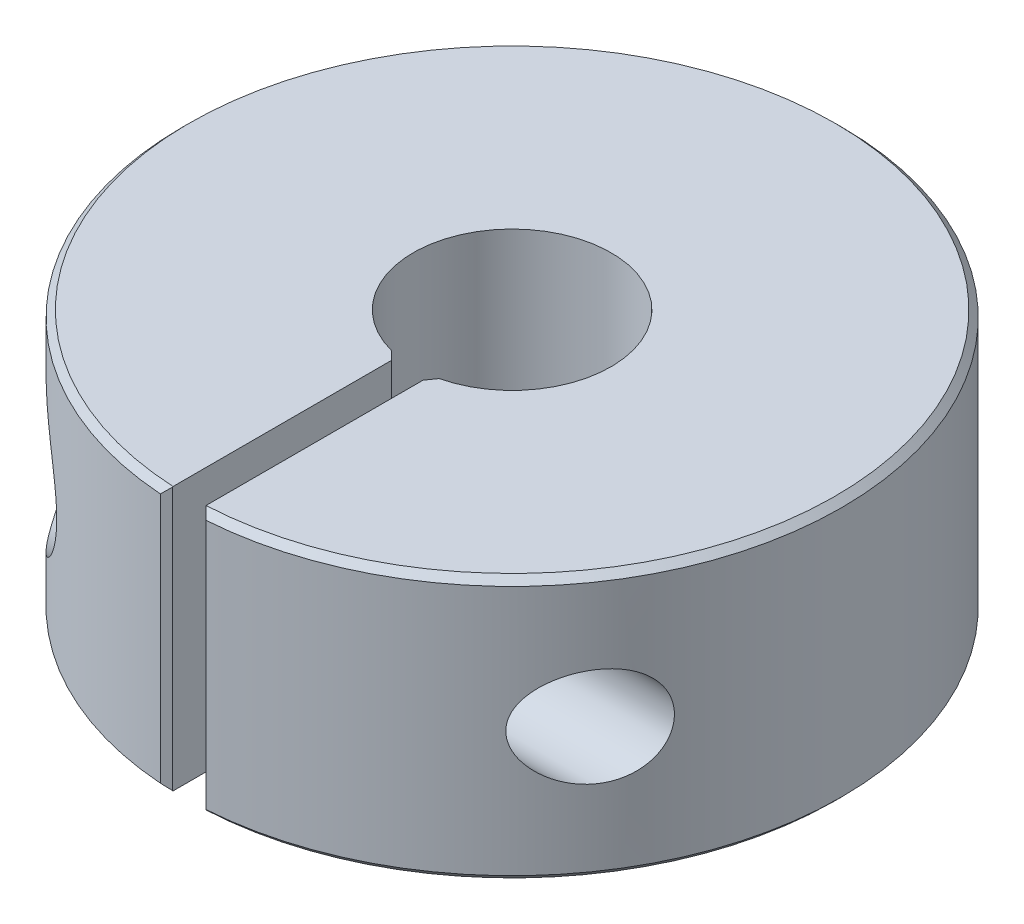
ISO-10303-21;
HEADER;
FILE_DESCRIPTION(('STEP AP214'),'2;1');
FILE_NAME('part.step','',(''),(''),'','','');
FILE_SCHEMA(('AUTOMOTIVE_DESIGN { 1 0 10303 214 1 1 1 1 }'));
ENDSEC;
DATA;
#1=APPLICATION_CONTEXT('core data for automotive mechanical design processes');
#2=APPLICATION_PROTOCOL_DEFINITION('international standard','automotive_design',2000,#1);
#3=PRODUCT_CONTEXT('',#1,'mechanical');
#4=PRODUCT('Part','Part','',(#3));
#5=PRODUCT_RELATED_PRODUCT_CATEGORY('part','',(#4));
#6=PRODUCT_DEFINITION_FORMATION('','',#4);
#7=PRODUCT_DEFINITION_CONTEXT('part definition',#1,'design');
#8=PRODUCT_DEFINITION('design','',#6,#7);
#9=PRODUCT_DEFINITION_SHAPE('','',#8);
#10=(LENGTH_UNIT() NAMED_UNIT(*) SI_UNIT(.MILLI.,.METRE.));
#11=(NAMED_UNIT(*) PLANE_ANGLE_UNIT() SI_UNIT($,.RADIAN.));
#12=(NAMED_UNIT(*) SI_UNIT($,.STERADIAN.) SOLID_ANGLE_UNIT());
#13=UNCERTAINTY_MEASURE_WITH_UNIT(LENGTH_MEASURE(1.E-05),#10,'distance_accuracy_value','');
#14=(GEOMETRIC_REPRESENTATION_CONTEXT(3) GLOBAL_UNCERTAINTY_ASSIGNED_CONTEXT((#13)) GLOBAL_UNIT_ASSIGNED_CONTEXT((#10,
#11,#12)) REPRESENTATION_CONTEXT('',''));
#15=CARTESIAN_POINT('',(0.,0.,0.));
#16=DIRECTION('',(0.,0.,1.));
#17=DIRECTION('',(1.,0.,0.));
#18=AXIS2_PLACEMENT_3D('',#15,#16,#17);
#19=CARTESIAN_POINT('',(0.,4.,0.));
#20=DIRECTION('',(0.,-1.,0.));
#21=DIRECTION('',(0.,0.,-1.));
#22=AXIS2_PLACEMENT_3D('',#19,#20,#21);
#23=CYLINDRICAL_SURFACE('',#22,10.);
#24=CARTESIAN_POINT('',(-9.56526568498302,0.,2.91645201840976));
#25=CARTESIAN_POINT('',(-9.56526527898537,0.148266947419081,2.91644805574262));
#26=CARTESIAN_POINT('',(-9.5616242409526,0.296503336295936,2.92847484811556));
#27=CARTESIAN_POINT('',(-9.54689716743945,0.588716962090297,2.97613433369995));
#28=CARTESIAN_POINT('',(-9.53581356039509,0.732695572285058,3.01175932700255));
#29=CARTESIAN_POINT('',(-9.50575675400809,1.01233217441802,3.10531513407493));
#30=CARTESIAN_POINT('',(-9.48678369481458,1.1479903141129,3.16324555160721));
#31=CARTESIAN_POINT('',(-9.44034621989921,1.40721011207905,3.2992426115922));
#32=CARTESIAN_POINT('',(-9.41288185308885,1.53077184002248,3.37730913805677));
#33=CARTESIAN_POINT('',(-9.34875573322593,1.76304331993647,3.5509630107994));
#34=CARTESIAN_POINT('',(-9.31205529638125,1.87168755776449,3.64662358156792));
#35=CARTESIAN_POINT('',(-9.22918147031763,2.07100284784143,3.8515454751007));
#36=CARTESIAN_POINT('',(-9.18300771206496,2.16167319964604,3.96080732763837));
#37=CARTESIAN_POINT('',(-9.07968729579243,2.32600242668557,4.19235056195457));
#38=CARTESIAN_POINT('',(-9.0222503934866,2.39906217807296,4.31492624617871));
#39=CARTESIAN_POINT('',(-8.89789917658437,2.52405511309625,4.5658529653815));
#40=CARTESIAN_POINT('',(-8.83098214529935,2.57598222424625,4.69420564863646));
#41=CARTESIAN_POINT('',(-8.68259857562874,2.66276043390266,4.96367404339943));
#42=CARTESIAN_POINT('',(-8.60038122918725,2.69580434889333,5.10495400266551));
#43=CARTESIAN_POINT('',(-8.42742318861182,2.73932392625721,5.38570263899248));
#44=CARTESIAN_POINT('',(-8.33667827006593,2.74978834097695,5.52517037895636));
#45=CARTESIAN_POINT('',(-8.13382734279602,2.75023735381917,5.82044926117813));
#46=CARTESIAN_POINT('',(-8.02058184674385,2.73682705984685,5.9754777131459));
#47=CARTESIAN_POINT('',(-7.78749254853974,2.68588136879945,6.27624804532686));
#48=CARTESIAN_POINT('',(-7.66764473815365,2.64833116558173,6.42198416577474));
#49=CARTESIAN_POINT('',(-7.39924932099589,2.54201691682627,6.73058391334973));
#50=CARTESIAN_POINT('',(-7.24976552998386,2.46850384572143,6.8910225225688));
#51=CARTESIAN_POINT('',(-7.0244187750582,2.33720678484105,7.11821805159709));
#52=CARTESIAN_POINT('',(-6.94904537591026,2.28988243009177,7.1917685892005));
#53=CARTESIAN_POINT('',(-6.79851955534688,2.18830760491503,7.33422392286254));
#54=CARTESIAN_POINT('',(-6.72336713725153,2.13405703096424,7.40312864945862));
#55=CARTESIAN_POINT('',(-6.58192217175585,2.02472240864769,7.52903078007034));
#56=CARTESIAN_POINT('',(-6.51553038700257,1.97032838194782,7.58651784986872));
#57=CARTESIAN_POINT('',(-6.38421905418996,1.85588701530281,7.69734502446064));
#58=CARTESIAN_POINT('',(-6.31929891306117,1.79584200482281,7.75068682161849));
#59=CARTESIAN_POINT('',(-6.19185631617,1.66992230304893,7.85287030035755));
#60=CARTESIAN_POINT('',(-6.12933006792844,1.60405743021828,7.90171928774017));
#61=CARTESIAN_POINT('',(-6.00773918906146,1.46606439932564,7.99455542873082));
#62=CARTESIAN_POINT('',(-5.94867241398467,1.39394019160719,8.03854560951532));
#63=CARTESIAN_POINT('',(-5.8274522797352,1.23213881084496,8.1269417735652));
#64=CARTESIAN_POINT('',(-5.76605575841747,1.14142431451149,8.17051615690642));
#65=CARTESIAN_POINT('',(-5.65318218029461,0.950518359548369,8.24901504646066));
#66=CARTESIAN_POINT('',(-5.60169168398769,0.8503400197837,8.28395129066408));
#67=CARTESIAN_POINT('',(-5.52223011850981,0.661699247626612,8.33707358894066));
#68=CARTESIAN_POINT('',(-5.49161207143822,0.57492761084441,8.35721481912961));
#69=CARTESIAN_POINT('',(-5.44260413812306,0.396533832686467,8.38921512466519));
#70=CARTESIAN_POINT('',(-5.42419687024068,0.304918787325577,8.4010859738401));
#71=CARTESIAN_POINT('',(-5.40181159612552,0.118448749400579,8.41549932082236));
#72=CARTESIAN_POINT('',(-5.39794152845488,0.0235747783363938,8.41797203919879));
#73=CARTESIAN_POINT('',(-5.40552244946268,-0.165313247258699,8.41310534978422));
#74=CARTESIAN_POINT('',(-5.41697867271236,-0.259326996944259,8.40576258959624));
#75=CARTESIAN_POINT('',(-5.45165458801781,-0.433750029578807,8.38330593675886));
#76=CARTESIAN_POINT('',(-5.47352580386855,-0.514556833738229,8.36908042689428));
#77=CARTESIAN_POINT('',(-5.52623897087327,-0.671722054745976,8.33436756791654));
#78=CARTESIAN_POINT('',(-5.55708460437112,-0.748078630128073,8.31387764824236));
#79=CARTESIAN_POINT('',(-5.65030162807037,-0.948831124338016,8.25100446505069));
#80=CARTESIAN_POINT('',(-5.71942670539512,-1.06845163742797,8.20345312038104));
#81=CARTESIAN_POINT('',(-5.87011185973074,-1.29379609568387,8.09631976698425));
#82=CARTESIAN_POINT('',(-5.95171658254255,-1.39946750312075,8.03669430456368));
#83=CARTESIAN_POINT('',(-6.10545782086362,-1.57854288700257,7.92027809204851));
#84=CARTESIAN_POINT('',(-6.17631437703535,-1.65421148142424,7.86522304051925));
#85=CARTESIAN_POINT('',(-6.32107473475828,-1.79791944886128,7.749361981115));
#86=CARTESIAN_POINT('',(-6.39498029558843,-1.86595433057114,7.68855262606585));
#87=CARTESIAN_POINT('',(-6.54461191288574,-1.99477296867885,7.56159338936059));
#88=CARTESIAN_POINT('',(-6.62033928398539,-2.05555128788096,7.4954395646577));
#89=CARTESIAN_POINT('',(-6.77261683148125,-2.16995074000298,7.35813665415467));
#90=CARTESIAN_POINT('',(-6.84916684621223,-2.22357325235615,7.28698853515763));
#91=CARTESIAN_POINT('',(-7.00546515295253,-2.32567862668531,7.13692181048283));
#92=CARTESIAN_POINT('',(-7.08521749851788,-2.3738656455105,7.05780525738708));
#93=CARTESIAN_POINT('',(-7.24410445173681,-2.4622526979034,6.89463296961769));
#94=CARTESIAN_POINT('',(-7.32323881923649,-2.50244976171518,6.81057541342663));
#95=CARTESIAN_POINT('',(-7.55851000594961,-2.61036660675842,6.55156652908046));
#96=CARTESIAN_POINT('',(-7.71285767306728,-2.6656352442903,6.36945344112164));
#97=CARTESIAN_POINT('',(-7.98768790504225,-2.73204938756373,6.01982690839229));
#98=CARTESIAN_POINT('',(-8.10967190349656,-2.74877965682176,5.85454178850282));
#99=CARTESIAN_POINT('',(-8.34327058290231,-2.75108810378651,5.51650407334515));
#100=CARTESIAN_POINT('',(-8.45489656286387,-2.73670065288688,5.34375992359064));
#101=CARTESIAN_POINT('',(-8.64811631093501,-2.67800506784768,5.02387924464175));
#102=CARTESIAN_POINT('',(-8.73166983562445,-2.63877498966649,4.8770018920849));
#103=CARTESIAN_POINT('',(-8.88759111706612,-2.5338531057295,4.58669947269393));
#104=CARTESIAN_POINT('',(-8.95996292079055,-2.46817090491213,4.44327317277132));
#105=CARTESIAN_POINT('',(-9.09269156456916,-2.3095027650383,4.16495934244637));
#106=CARTESIAN_POINT('',(-9.15298114951672,-2.21637075264733,4.03012231181652));
#107=CARTESIAN_POINT('',(-9.26055392112583,-2.0043641185328,3.7763958729351));
#108=CARTESIAN_POINT('',(-9.3078423490504,-1.88549990508693,3.65750004810742));
#109=CARTESIAN_POINT('',(-9.38566650405083,-1.63838981592324,3.45255231023448));
#110=CARTESIAN_POINT('',(-9.41739940276019,-1.5122472200721,3.36441147380208));
#111=CARTESIAN_POINT('',(-9.47121760239906,-1.24542685356331,3.2097917210802));
#112=CARTESIAN_POINT('',(-9.49330251809162,-1.1047485027808,3.1433136697969));
#113=CARTESIAN_POINT('',(-9.52933453999021,-0.806615232213448,3.0323878667646));
#114=CARTESIAN_POINT('',(-9.54287064565883,-0.648690209132174,2.9890663100111));
#115=CARTESIAN_POINT('',(-9.5608360020514,-0.32716402758318,2.93110195734074));
#116=CARTESIAN_POINT('',(-9.56526613286682,-0.163563419214473,2.91645638989915));
#117=CARTESIAN_POINT('',(-9.56526568498302,0.,2.91645201840976));
#118=B_SPLINE_CURVE_WITH_KNOTS('',3,(#24,#25,#26,#27,#28,#29,#30,#31,#32,#33,#34,#35,#36,#37,
#38,#39,#40,#41,#42,#43,#44,#45,#46,#47,#48,#49,#50,#51,#52,#53,#54,#55,#56,#57,#58,#59,#60,#61,
#62,#63,#64,#65,#66,#67,#68,#69,#70,#71,#72,#73,#74,#75,#76,#77,#78,#79,#80,#81,#82,#83,#84,#85,
#86,#87,#88,#89,#90,#91,#92,#93,#94,#95,#96,#97,#98,#99,#100,#101,#102,#103,#104,#105,#106,#107,
#108,#109,#110,#111,#112,#113,#114,#115,#116,#117),.UNSPECIFIED.,.T.,.F.,(4,2,2,2,2,2,2,2,2,2,2,
2,2,2,2,2,2,2,2,2,2,2,2,2,2,2,2,2,2,2,2,2,2,2,2,2,2,2,2,2,2,2,2,2,2,2,4),(0.,0.444220283479155,
0.88829569269675,1.33236321364445,1.77642817672923,2.22238492289784,2.66835904463477,
3.1278547531585,3.58748240517654,4.08583275376449,4.58443129115964,5.15966308122086,
5.73524802506679,6.42624408248123,6.77238973067179,7.11854055316457,7.4282213243628,
7.737774992578,8.04681604771278,8.35566346217085,8.70845983026258,9.0607741310375,
9.34229315115121,9.62341057343527,9.90661121014732,10.1899085964542,10.4437197268911,
10.6976351472285,11.1334654454718,11.5708930628784,11.9225693124851,12.2744513981984,
12.6265955090624,12.9786716383309,13.3449969358317,13.7114581378209,14.442828486429,
15.0588333027928,15.6741580523,16.1924146875614,16.7104833098792,17.2313601871446,
17.7520267701084,18.2209971370152,18.6899862278566,19.180083401436,19.6701332049496),.UNSPECIFIED.);
#119=CARTESIAN_POINT('',(-9.56526568498302,0.,2.91645201840976));
#120=VERTEX_POINT('',#119);
#121=EDGE_CURVE('E165',#120,#120,#118,.T.);
#122=ORIENTED_EDGE('',*,*,#121,.T.);
#123=EDGE_LOOP('',(#122));
#124=FACE_BOUND('',#123,.T.);
#125=DIRECTION('',(0.,-1.,0.));
#126=VECTOR('',#125,1.);
#127=CARTESIAN_POINT('',(0.688760100747901,4.,9.97625227846699));
#128=LINE('',#127,#126);
#129=CARTESIAN_POINT('',(0.688760100747901,3.80000000000001,9.97625227846699));
#130=VERTEX_POINT('',#129);
#131=CARTESIAN_POINT('',(0.688760100747901,-3.8,9.97625227846699));
#132=VERTEX_POINT('',#131);
#133=EDGE_CURVE('E226',#130,#132,#128,.T.);
#134=ORIENTED_EDGE('',*,*,#133,.T.);
#135=CARTESIAN_POINT('',(0.,-3.8,0.));
#136=DIRECTION('',(0.,1.,0.));
#137=DIRECTION('',(0.,0.,1.));
#138=AXIS2_PLACEMENT_3D('',#135,#136,#137);
#139=CIRCLE('',#138,10.);
#140=CARTESIAN_POINT('',(-0.697693077083156,-3.8,9.97563152738664));
#141=VERTEX_POINT('',#140);
#142=EDGE_CURVE('E231',#132,#141,#139,.T.);
#143=ORIENTED_EDGE('',*,*,#142,.T.);
#144=DIRECTION('',(0.,-1.,0.));
#145=VECTOR('',#144,1.);
#146=CARTESIAN_POINT('',(-0.697693077083156,4.,9.97563152738664));
#147=LINE('',#146,#145);
#148=CARTESIAN_POINT('',(-0.697693077083156,3.80000000000001,9.97563152738664));
#149=VERTEX_POINT('',#148);
#150=EDGE_CURVE('E228',#141,#149,#147,.F.);
#151=ORIENTED_EDGE('',*,*,#150,.T.);
#152=CARTESIAN_POINT('',(0.,3.80000000000001,0.));
#153=DIRECTION('',(0.,1.,0.));
#154=DIRECTION('',(0.,0.,1.));
#155=AXIS2_PLACEMENT_3D('',#152,#153,#154);
#156=CIRCLE('',#155,10.);
#157=EDGE_CURVE('E224',#149,#130,#156,.F.);
#158=ORIENTED_EDGE('',*,*,#157,.T.);
#159=EDGE_LOOP('',(#134,#143,#151,#158));
#160=FACE_BOUND('',#159,.T.);
#161=CARTESIAN_POINT('',(6.97437921738062,0.,7.16645201840976));
#162=CARTESIAN_POINT('',(6.97438043242214,-0.0675590567595136,7.16645103947924));
#163=CARTESIAN_POINT('',(6.97911825624856,-0.135124128170724,7.16184910864587));
#164=CARTESIAN_POINT('',(6.99751951185413,-0.267828838477065,7.14386991150756));
#165=CARTESIAN_POINT('',(7.01119079711041,-0.332966289924161,7.13048492390395));
#166=CARTESIAN_POINT('',(7.04594248167849,-0.458456224922473,7.09614518244943));
#167=CARTESIAN_POINT('',(7.06696263051235,-0.518842869751416,7.07525194807016));
#168=CARTESIAN_POINT('',(7.11484945313477,-0.634492602813443,7.02709558810926));
#169=CARTESIAN_POINT('',(7.14171933514506,-0.68975285572215,6.99982896650672));
#170=CARTESIAN_POINT('',(7.21328606687825,-0.819055665408793,6.92619601008752));
#171=CARTESIAN_POINT('',(7.26048765689773,-0.889998662972199,6.87682211376733));
#172=CARTESIAN_POINT('',(7.36079073765643,-1.02017310248308,6.76935750805091));
#173=CARTESIAN_POINT('',(7.41390552555923,-1.0793772810955,6.71124704540073));
#174=CARTESIAN_POINT('',(7.53865224219387,-1.20098700684466,6.57112898007752));
#175=CARTESIAN_POINT('',(7.61135748921858,-1.25978988158075,6.48694584365539));
#176=CARTESIAN_POINT('',(7.75875565677337,-1.35876571107772,6.30991400168907));
#177=CARTESIAN_POINT('',(7.83344918827038,-1.39893286785491,6.21706261003755));
#178=CARTESIAN_POINT('',(7.98279731223476,-1.46027079566996,6.02411164613885));
#179=CARTESIAN_POINT('',(8.05744800662097,-1.48130724680842,5.92396607591841));
#180=CARTESIAN_POINT('',(8.20392576178793,-1.50258618282718,5.71938924643504));
#181=CARTESIAN_POINT('',(8.27575262613515,-1.50282722366964,5.61495769005605));
#182=CARTESIAN_POINT('',(8.41398959653681,-1.48086760272039,5.4055915301287));
#183=CARTESIAN_POINT('',(8.48042755421717,-1.4587914901239,5.30066293562816));
#184=CARTESIAN_POINT('',(8.60599812081999,-1.39079773534173,5.09424244844872));
#185=CARTESIAN_POINT('',(8.66514585042626,-1.34493050451768,4.99274377054981));
#186=CARTESIAN_POINT('',(8.75823677991854,-1.245685551493,4.82696643963397));
#187=CARTESIAN_POINT('',(8.79452938380881,-1.19828882643361,4.76039562970175));
#188=CARTESIAN_POINT('',(8.86159391516161,-1.09159224843253,4.63435343929815));
#189=CARTESIAN_POINT('',(8.89236889468987,-1.03229901473222,4.57487814008558));
#190=CARTESIAN_POINT('',(8.94787670166238,-0.902543406684585,4.46534515962732));
#191=CARTESIAN_POINT('',(8.9725804417759,-0.832029831414785,4.41533306980214));
#192=CARTESIAN_POINT('',(9.01523579139888,-0.681881828478191,4.32757647037126));
#193=CARTESIAN_POINT('',(9.03318937930682,-0.602250082191563,4.28982836676187));
#194=CARTESIAN_POINT('',(9.0607311370315,-0.443749268845394,4.23132461625462));
#195=CARTESIAN_POINT('',(9.07091444594154,-0.365424718685295,4.20936990121741));
#196=CARTESIAN_POINT('',(9.08522019831489,-0.205729233977635,4.17840541726927));
#197=CARTESIAN_POINT('',(9.08934491426233,-0.124359453398568,4.16939079475949));
#198=CARTESIAN_POINT('',(9.09142467467425,0.0346199154330212,4.16485287722947));
#199=CARTESIAN_POINT('',(9.08968651326818,0.112207343947216,4.16865869700394));
#200=CARTESIAN_POINT('',(9.08073425634532,0.265547778463827,4.18812352309654));
#201=CARTESIAN_POINT('',(9.0735208115104,0.341301001339201,4.2037811209505));
#202=CARTESIAN_POINT('',(9.05377227456714,0.48841972146095,4.24614464579492));
#203=CARTESIAN_POINT('',(9.04126860806533,0.559808324942536,4.27278530634708));
#204=CARTESIAN_POINT('',(9.01112011478995,0.696854515777471,4.33600446980857));
#205=CARTESIAN_POINT('',(8.99347484376496,0.762511607272145,4.37258383143566));
#206=CARTESIAN_POINT('',(8.95261270319017,0.888760400939297,4.45566308717792));
#207=CARTESIAN_POINT('',(8.92922498494869,0.949100011679213,4.50246107389158));
#208=CARTESIAN_POINT('',(8.87762006792735,1.06091811161802,4.60337602477775));
#209=CARTESIAN_POINT('',(8.84940165658632,1.11239436948731,4.65749482584403));
#210=CARTESIAN_POINT('',(8.7862775944587,1.20938693511083,4.77557679324333));
#211=CARTESIAN_POINT('',(8.75102517886305,1.25414411105615,4.83997655532572));
#212=CARTESIAN_POINT('',(8.67614479186936,1.33230179445196,4.97296117087813));
#213=CARTESIAN_POINT('',(8.63651496392137,1.36569745856471,5.04154779452222));
#214=CARTESIAN_POINT('',(8.54861812105136,1.42458301307972,5.18935108845702));
#215=CARTESIAN_POINT('',(8.49988511373887,1.448646983465,5.26885705819558));
#216=CARTESIAN_POINT('',(8.39883127371579,1.4832596098871,5.42849702939673));
#217=CARTESIAN_POINT('',(8.34650879467131,1.49380201992087,5.50863130390845));
#218=CARTESIAN_POINT('',(8.2312244086926,1.50273653658807,5.6797091742514));
#219=CARTESIAN_POINT('',(8.16784176057527,1.49907522521972,5.77047660578135));
#220=CARTESIAN_POINT('',(8.0390711831874,1.47597041971167,5.94856656717726));
#221=CARTESIAN_POINT('',(7.97368139164061,1.45651181473254,6.0358857147015));
#222=CARTESIAN_POINT('',(7.83356964566315,1.39899937144099,6.21691070173135));
#223=CARTESIAN_POINT('',(7.75878092785283,1.35878764954013,6.30988456702186));
#224=CARTESIAN_POINT('',(7.61120142521443,1.25968011147248,6.48713236969326));
#225=CARTESIAN_POINT('',(7.53841013687695,1.20078905186249,6.571408514652));
#226=CARTESIAN_POINT('',(7.41480396817887,1.08022384001148,6.71023202153583));
#227=CARTESIAN_POINT('',(7.3628323850302,1.0224256127084,6.76712128052531));
#228=CARTESIAN_POINT('',(7.26448737602492,0.895561725636916,6.87258240875571));
#229=CARTESIAN_POINT('',(7.21810420360122,0.82651619167828,6.92116882252316));
#230=CARTESIAN_POINT('',(7.14470405431667,0.695945817774737,6.99680355513781));
#231=CARTESIAN_POINT('',(7.11574770237125,0.636878738045196,7.02619741319518));
#232=CARTESIAN_POINT('',(7.06458442849177,0.512876847296229,7.07763825855212));
#233=CARTESIAN_POINT('',(7.04236987493812,0.447948779713759,7.0996935557453));
#234=CARTESIAN_POINT('',(7.00833317962193,0.319904917891187,7.13328743150818));
#235=CARTESIAN_POINT('',(6.99571546510157,0.257218115591715,7.14563505062668));
#236=CARTESIAN_POINT('',(6.97874083112381,0.129688347372152,7.16221493519732));
#237=CARTESIAN_POINT('',(6.97437805111611,0.0648469444043308,7.16645295804178));
#238=CARTESIAN_POINT('',(6.97437921738062,0.,7.16645201840976));
#239=B_SPLINE_CURVE_WITH_KNOTS('',3,(#161,#162,#163,#164,#165,#166,#167,#168,#169,#170,#171,
#172,#173,#174,#175,#176,#177,#178,#179,#180,#181,#182,#183,#184,#185,#186,#187,#188,#189,#190,
#191,#192,#193,#194,#195,#196,#197,#198,#199,#200,#201,#202,#203,#204,#205,#206,#207,#208,#209,
#210,#211,#212,#213,#214,#215,#216,#217,#218,#219,#220,#221,#222,#223,#224,#225,#226,#227,#228,
#229,#230,#231,#232,#233,#234,#235,#236,#237,#238),.UNSPECIFIED.,.T.,.F.,(4,2,2,2,2,2,2,2,2,2,2,
2,2,2,2,2,2,2,2,2,2,2,2,2,2,2,2,2,2,2,2,2,2,2,2,2,2,2,4),(0.,0.202385428020556,0.40494901447937,
0.60588936760391,0.80694020312721,1.10076438942525,1.39526318675775,1.77080663178384,
2.14646683845267,2.52474470012368,2.90304882947088,3.27925328373396,3.65466382951348,
3.92180614314512,4.18880022840906,4.4570495821237,4.72522025337733,4.96989403641787,
5.21447602266704,5.44646221433214,5.67842084110815,5.90902048867049,6.13964006670611,
6.37819647311048,6.61681284803602,6.87371687964772,7.13073029093104,7.41852603060044,
7.70645466369221,8.03745350315283,8.3687693318321,8.74486645480578,9.12086788417919,
9.40888445366355,9.69639119921799,9.91178126473055,10.1269265944333,10.321325461565,
10.5155862643144),.UNSPECIFIED.);
#240=CARTESIAN_POINT('',(6.97437921738062,0.,7.16645201840976));
#241=VERTEX_POINT('',#240);
#242=EDGE_CURVE('E281',#241,#241,#239,.T.);
#243=ORIENTED_EDGE('',*,*,#242,.F.);
#244=EDGE_LOOP('',(#243));
#245=FACE_BOUND('',#244,.T.);
#246=ADVANCED_FACE('F34',(#124,#160,#245),#23,.T.);
#247=CARTESIAN_POINT('',(0.,4.,0.));
#248=DIRECTION('',(0.,-1.,0.));
#249=DIRECTION('',(0.,0.,-1.));
#250=AXIS2_PLACEMENT_3D('',#247,#248,#249);
#251=CYLINDRICAL_SURFACE('',#250,3.);
#252=CARTESIAN_POINT('',(0.,-4.,0.));
#253=DIRECTION('',(0.,-1.,0.));
#254=DIRECTION('',(0.,0.,1.));
#255=AXIS2_PLACEMENT_3D('',#252,#253,#254);
#256=CIRCLE('',#255,3.);
#257=CARTESIAN_POINT('',(-0.754456761053977,-4.,2.90358313049583));
#258=VERTEX_POINT('',#257);
#259=CARTESIAN_POINT('',(0.703070141816121,-4.,2.91645201840981));
#260=VERTEX_POINT('',#259);
#261=EDGE_CURVE('E259',#258,#260,#256,.T.);
#262=ORIENTED_EDGE('',*,*,#261,.T.);
#263=DIRECTION('',(0.,-1.,0.));
#264=VECTOR('',#263,1.);
#265=CARTESIAN_POINT('',(0.703070141816121,4.,2.91645201840981));
#266=LINE('',#265,#264);
#267=CARTESIAN_POINT('',(0.703070141816121,4.,2.91645201840981));
#268=VERTEX_POINT('',#267);
#269=EDGE_CURVE('E51',#260,#268,#266,.F.);
#270=ORIENTED_EDGE('',*,*,#269,.T.);
#271=CARTESIAN_POINT('',(0.,4.,0.));
#272=DIRECTION('',(0.,-1.,0.));
#273=DIRECTION('',(0.,0.,1.));
#274=AXIS2_PLACEMENT_3D('',#271,#272,#273);
#275=CIRCLE('',#274,3.);
#276=CARTESIAN_POINT('',(-0.754456761053977,4.,2.90358313049583));
#277=VERTEX_POINT('',#276);
#278=EDGE_CURVE('E133',#277,#268,#275,.T.);
#279=ORIENTED_EDGE('',*,*,#278,.F.);
#280=DIRECTION('',(0.,-1.,0.));
#281=VECTOR('',#280,1.);
#282=CARTESIAN_POINT('',(-0.754456761053978,4.,2.90358313049583));
#283=LINE('',#282,#281);
#284=EDGE_CURVE('E149',#277,#258,#283,.T.);
#285=ORIENTED_EDGE('',*,*,#284,.T.);
#286=EDGE_LOOP('',(#262,#270,#279,#285));
#287=FACE_BOUND('',#286,.T.);
#288=ADVANCED_FACE('F241',(#287),#251,.F.);
#289=CARTESIAN_POINT('',(0.5,4.,2.95803989154981));
#290=DIRECTION('',(1.,0.,0.));
#291=DIRECTION('',(0.,0.,-1.));
#292=AXIS2_PLACEMENT_3D('',#289,#290,#291);
#293=PLANE('',#292);
#294=CARTESIAN_POINT('',(0.5,0.,5.66645201840976));
#295=DIRECTION('',(1.,0.,0.));
#296=DIRECTION('',(0.,0.,-1.));
#297=AXIS2_PLACEMENT_3D('',#294,#295,#296);
#298=CIRCLE('',#297,1.5);
#299=CARTESIAN_POINT('',(0.500000000000001,0.,4.16645201840976));
#300=VERTEX_POINT('',#299);
#301=EDGE_CURVE('E278',#300,#300,#298,.F.);
#302=ORIENTED_EDGE('',*,*,#301,.F.);
#303=EDGE_LOOP('',(#302));
#304=FACE_BOUND('',#303,.T.);
#305=DIRECTION('',(0.,0.,1.));
#306=VECTOR('',#305,1.);
#307=CARTESIAN_POINT('',(0.5,4.,2.95803989154981));
#308=LINE('',#307,#306);
#309=CARTESIAN_POINT('',(0.5,4.,3.20213682507097));
#310=VERTEX_POINT('',#309);
#311=CARTESIAN_POINT('',(0.499999999999999,4.,9.78723658649366));
#312=VERTEX_POINT('',#311);
#313=EDGE_CURVE('E265',#310,#312,#308,.T.);
#314=ORIENTED_EDGE('',*,*,#313,.F.);
#315=DIRECTION('',(0.,-1.,0.));
#316=VECTOR('',#315,1.);
#317=CARTESIAN_POINT('',(0.5,4.,3.20213682507097));
#318=LINE('',#317,#316);
#319=CARTESIAN_POINT('',(0.5,-4.,3.20213682507097));
#320=VERTEX_POINT('',#319);
#321=EDGE_CURVE('E140',#310,#320,#318,.T.);
#322=ORIENTED_EDGE('',*,*,#321,.T.);
#323=DIRECTION('',(0.,0.,1.));
#324=VECTOR('',#323,1.);
#325=CARTESIAN_POINT('',(0.5,-4.,2.95803989154981));
#326=LINE('',#325,#324);
#327=CARTESIAN_POINT('',(0.499999999999999,-4.,9.78723658649366));
#328=VERTEX_POINT('',#327);
#329=EDGE_CURVE('E134',#320,#328,#326,.T.);
#330=ORIENTED_EDGE('',*,*,#329,.T.);
#331=CARTESIAN_POINT('',(0.499999999999999,-4.,9.78723658649366));
#332=CARTESIAN_POINT('',(0.499999999999999,-3.99995745694086,9.78727918503123));
#333=CARTESIAN_POINT('',(0.499999999999999,-3.99991491388171,9.7873217835688));
#334=CARTESIAN_POINT('',(0.499999999999999,-3.99982982776342,9.78740698064394));
#335=CARTESIAN_POINT('',(0.499999999999999,-3.99978728470428,9.78744957918151));
#336=CARTESIAN_POINT('',(0.499999999999999,-3.99974474164513,9.78749217771908));
#337=B_SPLINE_CURVE_WITH_KNOTS('',3,(#331,#332,#333,#334,#335,#336),.UNSPECIFIED.,.F.,.F.,(4,2,
4),(0.,0.000180612639538693,0.000361225279076158),.UNSPECIFIED.);
#338=CARTESIAN_POINT('',(0.499999999999999,-3.99974474164513,9.78749217771908));
#339=VERTEX_POINT('',#338);
#340=EDGE_CURVE('E139',#328,#339,#337,.T.);
#341=ORIENTED_EDGE('',*,*,#340,.T.);
#342=DIRECTION('',(0.,1.,0.));
#343=VECTOR('',#342,1.);
#344=CARTESIAN_POINT('',(0.499999999999999,4.,9.78749217771908));
#345=LINE('',#344,#343);
#346=CARTESIAN_POINT('',(0.499999999999999,3.99974474164514,9.78749217771908));
#347=VERTEX_POINT('',#346);
#348=EDGE_CURVE('E238',#339,#347,#345,.T.);
#349=ORIENTED_EDGE('',*,*,#348,.T.);
#350=CARTESIAN_POINT('',(0.499999999999999,3.99974474164514,9.78749217771908));
#351=CARTESIAN_POINT('',(0.499999999999999,3.99978728470428,9.78744957918151));
#352=CARTESIAN_POINT('',(0.499999999999999,3.99982982776342,9.78740698064394));
#353=CARTESIAN_POINT('',(0.499999999999999,3.99991491388171,9.7873217835688));
#354=CARTESIAN_POINT('',(0.499999999999999,3.99995745694086,9.78727918503123));
#355=CARTESIAN_POINT('',(0.499999999999999,4.,9.78723658649366));
#356=B_SPLINE_CURVE_WITH_KNOTS('',3,(#350,#351,#352,#353,#354,#355),.UNSPECIFIED.,.F.,.F.,(4,2,
4),(0.,0.000180612639535012,0.000361225279070024),.UNSPECIFIED.);
#357=EDGE_CURVE('E232',#347,#312,#356,.T.);
#358=ORIENTED_EDGE('',*,*,#357,.T.);
#359=EDGE_LOOP('',(#314,#322,#330,#341,#349,#358));
#360=FACE_BOUND('',#359,.T.);
#361=ADVANCED_FACE('F212',(#304,#360),#293,.F.);
#362=CARTESIAN_POINT('',(-0.5,4.,2.95803989154981));
#363=DIRECTION('',(-1.,0.,0.));
#364=DIRECTION('',(0.,0.,1.));
#365=AXIS2_PLACEMENT_3D('',#362,#363,#364);
#366=PLANE('',#365);
#367=CARTESIAN_POINT('',(-0.5,0.,5.66645201840976));
#368=DIRECTION('',(-1.,0.,0.));
#369=DIRECTION('',(0.,0.,1.));
#370=AXIS2_PLACEMENT_3D('',#367,#368,#369);
#371=CIRCLE('',#370,1.5);
#372=CARTESIAN_POINT('',(-0.5,0.,7.16645201840976));
#373=VERTEX_POINT('',#372);
#374=EDGE_CURVE('E38',#373,#373,#371,.F.);
#375=ORIENTED_EDGE('',*,*,#374,.F.);
#376=EDGE_LOOP('',(#375));
#377=FACE_BOUND('',#376,.T.);
#378=DIRECTION('',(0.,0.,-1.));
#379=VECTOR('',#378,1.);
#380=CARTESIAN_POINT('',(-0.5,-4.,2.95803989154981));
#381=LINE('',#380,#379);
#382=CARTESIAN_POINT('',(-0.499999999999999,-4.,9.78723658649366));
#383=VERTEX_POINT('',#382);
#384=CARTESIAN_POINT('',(-0.5,-4.,3.1580398915498));
#385=VERTEX_POINT('',#384);
#386=EDGE_CURVE('E117',#383,#385,#381,.T.);
#387=ORIENTED_EDGE('',*,*,#386,.T.);
#388=DIRECTION('',(0.,1.,0.));
#389=VECTOR('',#388,1.);
#390=CARTESIAN_POINT('',(-0.5,4.,3.1580398915498));
#391=LINE('',#390,#389);
#392=CARTESIAN_POINT('',(-0.5,4.,3.1580398915498));
#393=VERTEX_POINT('',#392);
#394=EDGE_CURVE('E124',#385,#393,#391,.T.);
#395=ORIENTED_EDGE('',*,*,#394,.T.);
#396=DIRECTION('',(0.,0.,-1.));
#397=VECTOR('',#396,1.);
#398=CARTESIAN_POINT('',(-0.5,4.,2.95803989154981));
#399=LINE('',#398,#397);
#400=CARTESIAN_POINT('',(-0.499999999999999,4.,9.78723658649366));
#401=VERTEX_POINT('',#400);
#402=EDGE_CURVE('E205',#401,#393,#399,.T.);
#403=ORIENTED_EDGE('',*,*,#402,.F.);
#404=CARTESIAN_POINT('',(-0.499999999999999,4.,9.78723658649366));
#405=CARTESIAN_POINT('',(-0.499999999999999,3.99841003396735,9.78882862598026));
#406=CARTESIAN_POINT('',(-0.499999999999999,3.99682006742985,9.79042066496266));
#407=CARTESIAN_POINT('',(-0.499999999999999,3.99364013334515,9.79360474191909));
#408=CARTESIAN_POINT('',(-0.499999999999999,3.99205016579795,9.79519677989311));
#409=CARTESIAN_POINT('',(-0.499999999999999,3.9904601977459,9.79678881736294));
#410=B_SPLINE_CURVE_WITH_KNOTS('',3,(#404,#405,#406,#407,#408,#409),.UNSPECIFIED.,.F.,.F.,(4,2,
4),(0.,0.00675005447435903,0.0135001089487175),.UNSPECIFIED.);
#411=CARTESIAN_POINT('',(-0.499999999999999,3.9904601977459,9.79678881736294));
#412=VERTEX_POINT('',#411);
#413=EDGE_CURVE('E198',#401,#412,#410,.T.);
#414=ORIENTED_EDGE('',*,*,#413,.T.);
#415=DIRECTION('',(0.,-1.,0.));
#416=VECTOR('',#415,1.);
#417=CARTESIAN_POINT('',(-0.499999999999999,4.,9.79678881736294));
#418=LINE('',#417,#416);
#419=CARTESIAN_POINT('',(-0.499999999999999,-3.9904601977459,9.79678881736294));
#420=VERTEX_POINT('',#419);
#421=EDGE_CURVE('E120',#412,#420,#418,.T.);
#422=ORIENTED_EDGE('',*,*,#421,.T.);
#423=CARTESIAN_POINT('',(-0.499999999999999,-3.9904601977459,9.79678881736294));
#424=CARTESIAN_POINT('',(-0.499999999999999,-3.99205016579795,9.79519677989311));
#425=CARTESIAN_POINT('',(-0.499999999999999,-3.99364013334514,9.79360474191909));
#426=CARTESIAN_POINT('',(-0.499999999999999,-3.99682006742985,9.79042066496266));
#427=CARTESIAN_POINT('',(-0.499999999999999,-3.99841003396735,9.78882862598025));
#428=CARTESIAN_POINT('',(-0.499999999999999,-4.,9.78723658649366));
#429=B_SPLINE_CURVE_WITH_KNOTS('',3,(#423,#424,#425,#426,#427,#428),.UNSPECIFIED.,.F.,.F.,(4,2,
4),(0.,0.00675005447436092,0.013500108948723),.UNSPECIFIED.);
#430=EDGE_CURVE('E114',#420,#383,#429,.T.);
#431=ORIENTED_EDGE('',*,*,#430,.T.);
#432=EDGE_LOOP('',(#387,#395,#403,#414,#422,#431));
#433=FACE_BOUND('',#432,.T.);
#434=ADVANCED_FACE('F116',(#377,#433),#366,.F.);
#435=CARTESIAN_POINT('',(0.,4.,0.));
#436=DIRECTION('',(0.,1.,0.));
#437=DIRECTION('',(0.,0.,1.));
#438=AXIS2_PLACEMENT_3D('',#435,#436,#437);
#439=PLANE('',#438);
#440=ORIENTED_EDGE('',*,*,#278,.T.);
#441=DIRECTION('',(0.579365558580644,0.,-0.815067818976151));
#442=VECTOR('',#441,1.);
#443=CARTESIAN_POINT('',(1.8442879421599,4.,1.31095460882658));
#444=LINE('',#443,#442);
#445=EDGE_CURVE('E11',#268,#310,#444,.F.);
#446=ORIENTED_EDGE('',*,*,#445,.T.);
#447=ORIENTED_EDGE('',*,*,#313,.T.);
#448=CARTESIAN_POINT('',(0.,4.,0.));
#449=DIRECTION('',(0.,1.,0.));
#450=DIRECTION('',(0.,0.,1.));
#451=AXIS2_PLACEMENT_3D('',#448,#449,#450);
#452=CIRCLE('',#451,9.8);
#453=EDGE_CURVE('E153',#312,#401,#452,.T.);
#454=ORIENTED_EDGE('',*,*,#453,.T.);
#455=ORIENTED_EDGE('',*,*,#402,.T.);
#456=DIRECTION('',(0.707106781186548,0.,0.707106781186547));
#457=VECTOR('',#456,1.);
#458=CARTESIAN_POINT('',(-1.8290199457749,4.,1.82901994577491));
#459=LINE('',#458,#457);
#460=EDGE_CURVE('E43',#393,#277,#459,.F.);
#461=ORIENTED_EDGE('',*,*,#460,.T.);
#462=EDGE_LOOP('',(#440,#446,#447,#454,#455,#461));
#463=FACE_BOUND('',#462,.T.);
#464=ADVANCED_FACE('F211',(#463),#439,.T.);
#465=CARTESIAN_POINT('',(0.,-4.,0.));
#466=DIRECTION('',(0.,1.,0.));
#467=DIRECTION('',(0.,0.,1.));
#468=AXIS2_PLACEMENT_3D('',#465,#466,#467);
#469=PLANE('',#468);
#470=ORIENTED_EDGE('',*,*,#329,.F.);
#471=DIRECTION('',(-0.579365558580644,0.,0.815067818976151));
#472=VECTOR('',#471,1.);
#473=CARTESIAN_POINT('',(0.5,-4.,3.20213682507097));
#474=LINE('',#473,#472);
#475=EDGE_CURVE('E142',#320,#260,#474,.F.);
#476=ORIENTED_EDGE('',*,*,#475,.T.);
#477=ORIENTED_EDGE('',*,*,#261,.F.);
#478=DIRECTION('',(-0.707106781186548,0.,-0.707106781186547));
#479=VECTOR('',#478,1.);
#480=CARTESIAN_POINT('',(-0.754456761053977,-4.,2.90358313049583));
#481=LINE('',#480,#479);
#482=EDGE_CURVE('E132',#258,#385,#481,.F.);
#483=ORIENTED_EDGE('',*,*,#482,.T.);
#484=ORIENTED_EDGE('',*,*,#386,.F.);
#485=CARTESIAN_POINT('',(0.,-4.,0.));
#486=DIRECTION('',(0.,1.,0.));
#487=DIRECTION('',(0.,0.,1.));
#488=AXIS2_PLACEMENT_3D('',#485,#486,#487);
#489=CIRCLE('',#488,9.8);
#490=EDGE_CURVE('E129',#383,#328,#489,.F.);
#491=ORIENTED_EDGE('',*,*,#490,.T.);
#492=EDGE_LOOP('',(#470,#476,#477,#483,#484,#491));
#493=FACE_BOUND('',#492,.T.);
#494=ADVANCED_FACE('F128',(#493),#469,.F.);
#495=CARTESIAN_POINT('',(0.688760100747901,4.,9.97625227846699));
#496=DIRECTION('',(0.707106781186556,0.,-0.707106781186539));
#497=DIRECTION('',(0.,-1.,0.));
#498=AXIS2_PLACEMENT_3D('',#495,#496,#497);
#499=PLANE('',#498);
#500=CARTESIAN_POINT('',(0.688760100747901,-3.8,9.97625227846699));
#501=CARTESIAN_POINT('',(0.657389629235047,-3.83346002864907,9.94488180695413));
#502=CARTESIAN_POINT('',(0.625974385658639,-3.86683543750634,9.91346656337772));
#503=CARTESIAN_POINT('',(0.563054352082541,-3.93341701806707,9.85054652980162));
#504=CARTESIAN_POINT('',(0.531549562076315,-3.96662318975818,9.8190417397954));
#505=CARTESIAN_POINT('',(0.499999999999999,-3.99974474164513,9.78749217771908));
#506=B_SPLINE_CURVE_WITH_KNOTS('',3,(#500,#501,#502,#503,#504,#505),.UNSPECIFIED.,.F.,.F.,(4,2,
4),(0.,0.166702659753461,0.333405331674076),.UNSPECIFIED.);
#507=EDGE_CURVE('E260',#132,#339,#506,.T.);
#508=ORIENTED_EDGE('',*,*,#507,.F.);
#509=ORIENTED_EDGE('',*,*,#133,.F.);
#510=CARTESIAN_POINT('',(0.499999999999999,3.99974474164514,9.78749217771908));
#511=CARTESIAN_POINT('',(0.531549562076315,3.96662318975818,9.8190417397954));
#512=CARTESIAN_POINT('',(0.563054352082541,3.93341701806707,9.85054652980162));
#513=CARTESIAN_POINT('',(0.625974385658639,3.86683543750634,9.91346656337772));
#514=CARTESIAN_POINT('',(0.657389629235047,3.83346002864907,9.94488180695413));
#515=CARTESIAN_POINT('',(0.688760100747901,3.80000000000001,9.97625227846699));
#516=B_SPLINE_CURVE_WITH_KNOTS('',3,(#510,#511,#512,#513,#514,#515),.UNSPECIFIED.,.F.,.F.,(4,2,
4),(0.,0.166702671920613,0.333405331674074),.UNSPECIFIED.);
#517=EDGE_CURVE('E192',#347,#130,#516,.T.);
#518=ORIENTED_EDGE('',*,*,#517,.F.);
#519=ORIENTED_EDGE('',*,*,#348,.F.);
#520=EDGE_LOOP('',(#508,#509,#518,#519));
#521=FACE_BOUND('',#520,.T.);
#522=ADVANCED_FACE('F184',(#521),#499,.F.);
#523=CARTESIAN_POINT('',(0.,4.,0.));
#524=DIRECTION('',(0.,-1.,0.));
#525=DIRECTION('',(0.,0.,-1.));
#526=AXIS2_PLACEMENT_3D('',#523,#524,#525);
#527=CONICAL_SURFACE('',#526,9.8,0.785398163397457);
#528=ORIENTED_EDGE('',*,*,#517,.T.);
#529=ORIENTED_EDGE('',*,*,#157,.F.);
#530=CARTESIAN_POINT('',(-0.697693077083156,3.80000000000001,9.97563152738664));
#531=CARTESIAN_POINT('',(-0.664846911896094,3.83193716655366,9.94591729923757));
#532=CARTESIAN_POINT('',(-0.631949406968081,3.86377743225454,9.91615662667811));
#533=CARTESIAN_POINT('',(-0.566051714616421,3.92726416485423,9.85654239001204));
#534=CARTESIAN_POINT('',(-0.533051527183381,3.95891063173531,9.82668882589693));
#535=CARTESIAN_POINT('',(-0.499999999999999,3.9904601977459,9.79678881736294));
#536=B_SPLINE_CURVE_WITH_KNOTS('',3,(#530,#531,#532,#533,#534,#535),.UNSPECIFIED.,.F.,.F.,(4,2,
4),(0.,0.163816097604121,0.327632210192036),.UNSPECIFIED.);
#537=EDGE_CURVE('E164',#412,#149,#536,.F.);
#538=ORIENTED_EDGE('',*,*,#537,.F.);
#539=ORIENTED_EDGE('',*,*,#413,.F.);
#540=ORIENTED_EDGE('',*,*,#453,.F.);
#541=ORIENTED_EDGE('',*,*,#357,.F.);
#542=EDGE_LOOP('',(#528,#529,#538,#539,#540,#541));
#543=FACE_BOUND('',#542,.T.);
#544=ADVANCED_FACE('F179',(#543),#527,.T.);
#545=CARTESIAN_POINT('',(0.,-3.8,0.));
#546=DIRECTION('',(0.,1.,0.));
#547=DIRECTION('',(0.,0.,1.));
#548=AXIS2_PLACEMENT_3D('',#545,#546,#547);
#549=CONICAL_SURFACE('',#548,10.,0.785398163397448);
#550=ORIENTED_EDGE('',*,*,#490,.F.);
#551=ORIENTED_EDGE('',*,*,#430,.F.);
#552=CARTESIAN_POINT('',(-0.499999999999999,-3.9904601977459,9.79678881736294));
#553=CARTESIAN_POINT('',(-0.53305152718338,-3.95891063173531,9.82668882589693));
#554=CARTESIAN_POINT('',(-0.566051714616421,-3.92726416485422,9.85654239001204));
#555=CARTESIAN_POINT('',(-0.631949406968081,-3.86377743225453,9.91615662667811));
#556=CARTESIAN_POINT('',(-0.664846911896094,-3.83193716655365,9.94591729923757));
#557=CARTESIAN_POINT('',(-0.697693077083156,-3.8,9.97563152738664));
#558=B_SPLINE_CURVE_WITH_KNOTS('',3,(#552,#553,#554,#555,#556,#557),.UNSPECIFIED.,.F.,.F.,(4,2,
4),(0.,0.163816112587916,0.327632210192038),.UNSPECIFIED.);
#559=EDGE_CURVE('E156',#141,#420,#558,.F.);
#560=ORIENTED_EDGE('',*,*,#559,.F.);
#561=ORIENTED_EDGE('',*,*,#142,.F.);
#562=ORIENTED_EDGE('',*,*,#507,.T.);
#563=ORIENTED_EDGE('',*,*,#340,.F.);
#564=EDGE_LOOP('',(#550,#551,#560,#561,#562,#563));
#565=FACE_BOUND('',#564,.T.);
#566=ADVANCED_FACE('F137',(#565),#549,.T.);
#567=CARTESIAN_POINT('',(-0.499999999999999,4.,9.79678881736294));
#568=DIRECTION('',(-0.670867005531946,0.,-0.741577683650607));
#569=DIRECTION('',(0.,-1.,0.));
#570=AXIS2_PLACEMENT_3D('',#567,#568,#569);
#571=PLANE('',#570);
#572=ORIENTED_EDGE('',*,*,#537,.T.);
#573=ORIENTED_EDGE('',*,*,#150,.F.);
#574=ORIENTED_EDGE('',*,*,#559,.T.);
#575=ORIENTED_EDGE('',*,*,#421,.F.);
#576=EDGE_LOOP('',(#572,#573,#574,#575));
#577=FACE_BOUND('',#576,.T.);
#578=ADVANCED_FACE('F174',(#577),#571,.F.);
#579=CARTESIAN_POINT('',(0.5,4.,3.20213682507097));
#580=DIRECTION('',(0.815067818976151,0.,0.579365558580644));
#581=DIRECTION('',(0.,-1.,0.));
#582=AXIS2_PLACEMENT_3D('',#579,#580,#581);
#583=PLANE('',#582);
#584=ORIENTED_EDGE('',*,*,#445,.F.);
#585=ORIENTED_EDGE('',*,*,#269,.F.);
#586=ORIENTED_EDGE('',*,*,#475,.F.);
#587=ORIENTED_EDGE('',*,*,#321,.F.);
#588=EDGE_LOOP('',(#584,#585,#586,#587));
#589=FACE_BOUND('',#588,.T.);
#590=ADVANCED_FACE('F177',(#589),#583,.F.);
#591=CARTESIAN_POINT('',(-0.754456761053977,4.,2.90358313049583));
#592=DIRECTION('',(-0.707106781186547,0.,0.707106781186548));
#593=DIRECTION('',(0.,-1.,0.));
#594=AXIS2_PLACEMENT_3D('',#591,#592,#593);
#595=PLANE('',#594);
#596=ORIENTED_EDGE('',*,*,#460,.F.);
#597=ORIENTED_EDGE('',*,*,#394,.F.);
#598=ORIENTED_EDGE('',*,*,#482,.F.);
#599=ORIENTED_EDGE('',*,*,#284,.F.);
#600=EDGE_LOOP('',(#596,#597,#598,#599));
#601=FACE_BOUND('',#600,.T.);
#602=ADVANCED_FACE('F36',(#601),#595,.F.);
#603=CARTESIAN_POINT('',(-10.,0.,5.66645201840976));
#604=DIRECTION('',(1.,0.,0.));
#605=DIRECTION('',(0.,0.,-1.));
#606=AXIS2_PLACEMENT_3D('',#603,#604,#605);
#607=CYLINDRICAL_SURFACE('',#606,2.75);
#608=CARTESIAN_POINT('',(-3.,0.,5.66645201840976));
#609=DIRECTION('',(1.,0.,0.));
#610=DIRECTION('',(0.,0.,-1.));
#611=AXIS2_PLACEMENT_3D('',#608,#609,#610);
#612=CIRCLE('',#611,2.75);
#613=CARTESIAN_POINT('',(-3.,0.,2.91645201840976));
#614=VERTEX_POINT('',#613);
#615=EDGE_CURVE('E275',#614,#614,#612,.T.);
#616=ORIENTED_EDGE('',*,*,#615,.T.);
#617=EDGE_LOOP('',(#616));
#618=FACE_BOUND('',#617,.T.);
#619=ORIENTED_EDGE('',*,*,#121,.F.);
#620=EDGE_LOOP('',(#619));
#621=FACE_BOUND('',#620,.T.);
#622=ADVANCED_FACE('F298',(#618,#621),#607,.F.);
#623=CARTESIAN_POINT('',(-3.,0.,5.66645201840976));
#624=DIRECTION('',(1.,0.,0.));
#625=DIRECTION('',(0.,0.,-1.));
#626=AXIS2_PLACEMENT_3D('',#623,#624,#625);
#627=PLANE('',#626);
#628=CARTESIAN_POINT('',(-3.,0.,5.66645201840976));
#629=DIRECTION('',(1.,0.,0.));
#630=DIRECTION('',(0.,0.,-1.));
#631=AXIS2_PLACEMENT_3D('',#628,#629,#630);
#632=CIRCLE('',#631,1.5);
#633=CARTESIAN_POINT('',(-3.,0.,4.16645201840976));
#634=VERTEX_POINT('',#633);
#635=EDGE_CURVE('E288',#634,#634,#632,.T.);
#636=ORIENTED_EDGE('',*,*,#635,.T.);
#637=EDGE_LOOP('',(#636));
#638=FACE_BOUND('',#637,.T.);
#639=ORIENTED_EDGE('',*,*,#615,.F.);
#640=EDGE_LOOP('',(#639));
#641=FACE_BOUND('',#640,.T.);
#642=ADVANCED_FACE('F295',(#638,#641),#627,.F.);
#643=CARTESIAN_POINT('',(10.,0.,5.66645201840976));
#644=DIRECTION('',(-1.,0.,0.));
#645=DIRECTION('',(0.,0.,1.));
#646=AXIS2_PLACEMENT_3D('',#643,#644,#645);
#647=CYLINDRICAL_SURFACE('',#646,1.5);
#648=ORIENTED_EDGE('',*,*,#635,.F.);
#649=EDGE_LOOP('',(#648));
#650=FACE_BOUND('',#649,.T.);
#651=ORIENTED_EDGE('',*,*,#374,.T.);
#652=EDGE_LOOP('',(#651));
#653=FACE_BOUND('',#652,.T.);
#654=ADVANCED_FACE('F293',(#650,#653),#647,.F.);
#655=ORIENTED_EDGE('',*,*,#242,.T.);
#656=EDGE_LOOP('',(#655));
#657=FACE_BOUND('',#656,.T.);
#658=ORIENTED_EDGE('',*,*,#301,.T.);
#659=EDGE_LOOP('',(#658));
#660=FACE_BOUND('',#659,.T.);
#661=ADVANCED_FACE('F289',(#657,#660),#647,.F.);
#662=CLOSED_SHELL('',(#246,#288,#361,#434,#464,#494,#522,#544,#566,#578,#590,#602,#622,#642,
#654,#661));
#663=MANIFOLD_SOLID_BREP('B2',#662);
#664=ADVANCED_BREP_SHAPE_REPRESENTATION('',(#18,#663),#14);
#665=SHAPE_DEFINITION_REPRESENTATION(#9,#664);
ENDSEC;
END-ISO-10303-21;
